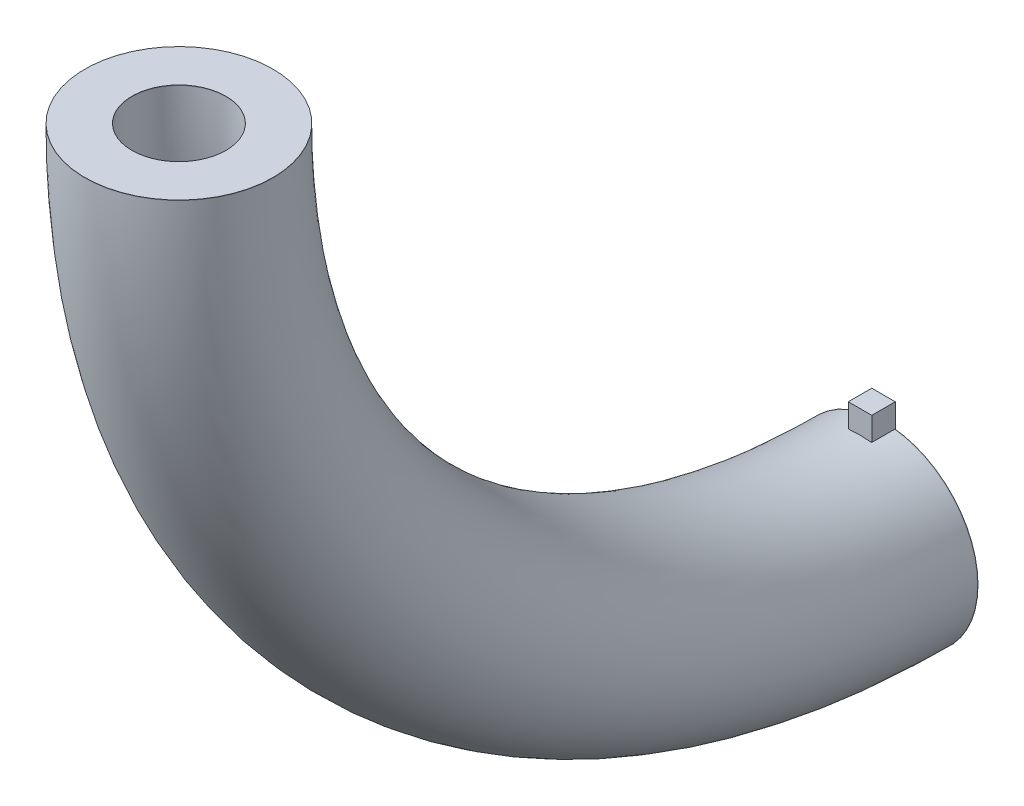
ISO-10303-21;
HEADER;
FILE_DESCRIPTION(('STEP AP214'),'2;1');
FILE_NAME('part.step','',(''),(''),'','','');
FILE_SCHEMA(('AUTOMOTIVE_DESIGN { 1 0 10303 214 1 1 1 1 }'));
ENDSEC;
DATA;
#1=APPLICATION_CONTEXT('core data for automotive mechanical design processes');
#2=APPLICATION_PROTOCOL_DEFINITION('international standard','automotive_design',2000,#1);
#3=PRODUCT_CONTEXT('',#1,'mechanical');
#4=PRODUCT('Part','Part','',(#3));
#5=PRODUCT_RELATED_PRODUCT_CATEGORY('part','',(#4));
#6=PRODUCT_DEFINITION_FORMATION('','',#4);
#7=PRODUCT_DEFINITION_CONTEXT('part definition',#1,'design');
#8=PRODUCT_DEFINITION('design','',#6,#7);
#9=PRODUCT_DEFINITION_SHAPE('','',#8);
#10=(LENGTH_UNIT() NAMED_UNIT(*) SI_UNIT(.MILLI.,.METRE.));
#11=(NAMED_UNIT(*) PLANE_ANGLE_UNIT() SI_UNIT($,.RADIAN.));
#12=(NAMED_UNIT(*) SI_UNIT($,.STERADIAN.) SOLID_ANGLE_UNIT());
#13=UNCERTAINTY_MEASURE_WITH_UNIT(LENGTH_MEASURE(1.E-05),#10,'distance_accuracy_value','');
#14=(GEOMETRIC_REPRESENTATION_CONTEXT(3) GLOBAL_UNCERTAINTY_ASSIGNED_CONTEXT((#13)) GLOBAL_UNIT_ASSIGNED_CONTEXT((#10,
#11,#12)) REPRESENTATION_CONTEXT('',''));
#15=CARTESIAN_POINT('',(0.,0.,0.));
#16=DIRECTION('',(0.,0.,1.));
#17=DIRECTION('',(1.,0.,0.));
#18=AXIS2_PLACEMENT_3D('',#15,#16,#17);
#19=CARTESIAN_POINT('',(0.,14.99,0.00999999999999959));
#20=DIRECTION('',(-1.,0.,0.));
#21=DIRECTION('',(0.,0.,1.));
#22=AXIS2_PLACEMENT_3D('',#19,#20,#21);
#23=TOROIDAL_SURFACE('',#22,14.99,2.);
#24=CARTESIAN_POINT('',(0.,14.99,15.));
#25=DIRECTION('',(0.,1.,0.));
#26=DIRECTION('',(1.,0.,0.));
#27=AXIS2_PLACEMENT_3D('',#24,#25,#26);
#28=CIRCLE('',#27,2.);
#29=CARTESIAN_POINT('',(2.,14.99,15.));
#30=VERTEX_POINT('',#29);
#31=EDGE_CURVE('E122',#30,#30,#28,.T.);
#32=ORIENTED_EDGE('',*,*,#31,.F.);
#33=EDGE_LOOP('',(#32));
#34=FACE_BOUND('',#33,.T.);
#35=CARTESIAN_POINT('',(0.,2.,0.00999999999999959));
#36=CARTESIAN_POINT('',(0.00277541085037885,2.,0.0170732180786881));
#37=CARTESIAN_POINT('',(0.00555082313203522,2.,0.0241464366166013));
#38=CARTESIAN_POINT('',(0.0935618743159835,2.,0.248446740129247));
#39=CARTESIAN_POINT('',(0.178781724111193,2.,0.465680885401677));
#40=CARTESIAN_POINT('',(0.348136764687458,2.,0.90057263324786));
#41=CARTESIAN_POINT('',(0.432271946457802,2.,1.11823023932218));
#42=CARTESIAN_POINT('',(0.515337549956219,2.,1.33630243825391));
#43=B_SPLINE_CURVE_WITH_KNOTS('',3,(#35,#36,#37,#38,#39,#40,#41,#42),.UNSPECIFIED.,.F.,.F.,(4,2,
2,4),(0.,0.0227947362344989,0.722847853738164,1.42290678308241),.UNSPECIFIED.);
#44=CARTESIAN_POINT('',(0.,2.,0.00999999999999776));
#45=VERTEX_POINT('',#44);
#46=CARTESIAN_POINT('',(0.195919297869507,2.,0.509999999999997));
#47=VERTEX_POINT('',#46);
#48=EDGE_CURVE('E44',#45,#47,#43,.T.);
#49=ORIENTED_EDGE('',*,*,#48,.T.);
#50=CARTESIAN_POINT('',(-0.181908763773715,2.00133032957437,0.509999999999997));
#51=CARTESIAN_POINT('',(-0.293737185188782,1.99110412585077,0.509999999999997));
#52=CARTESIAN_POINT('',(-0.404783340480492,1.97142353201096,0.509999999999997));
#53=CARTESIAN_POINT('',(-0.622085918102416,1.91367641319412,0.509999999999997));
#54=CARTESIAN_POINT('',(-0.728336400376222,1.87558773568901,0.509999999999997));
#55=CARTESIAN_POINT('',(-0.932889963828244,1.78212673631901,0.509999999999997));
#56=CARTESIAN_POINT('',(-1.03119698647625,1.72676305327726,0.509999999999997));
#57=CARTESIAN_POINT('',(-1.21709840250675,1.60033823965166,0.509999999999997));
#58=CARTESIAN_POINT('',(-1.30469543440206,1.52928098748995,0.509999999999997));
#59=CARTESIAN_POINT('',(-1.46677329653677,1.37343930998043,0.509999999999997));
#60=CARTESIAN_POINT('',(-1.54124719831917,1.28864767852902,0.509999999999997));
#61=CARTESIAN_POINT('',(-1.67491676848593,1.10776856215384,0.509999999999997));
#62=CARTESIAN_POINT('',(-1.73411178444127,1.01168059511624,0.509999999999997));
#63=CARTESIAN_POINT('',(-1.83557898771618,0.810872418535294,0.509999999999997));
#64=CARTESIAN_POINT('',(-1.87784025926893,0.706146693225231,0.509999999999997));
#65=CARTESIAN_POINT('',(-1.94418919795878,0.491088562453816,0.509999999999997));
#66=CARTESIAN_POINT('',(-1.96827685240917,0.380756153078587,0.509999999999997));
#67=CARTESIAN_POINT('',(-1.99760243723497,0.157567498462781,0.509999999999997));
#68=CARTESIAN_POINT('',(-2.00283257704932,0.044710229501782,0.509999999999997));
#69=CARTESIAN_POINT('',(-1.99427197211424,-0.18028049976667,0.509999999999997));
#70=CARTESIAN_POINT('',(-1.9804812507033,-0.292413960962063,0.509999999999997));
#71=CARTESIAN_POINT('',(-1.93426753546742,-0.512775516595181,0.509999999999997));
#72=CARTESIAN_POINT('',(-1.9018442255002,-0.621003544735648,0.509999999999997));
#73=CARTESIAN_POINT('',(-1.81928224382609,-0.830477540567552,0.509999999999997));
#74=CARTESIAN_POINT('',(-1.76914357619364,-0.931723509864819,0.509999999999997));
#75=CARTESIAN_POINT('',(-1.65258970085773,-1.12432472061953,0.509999999999997));
#76=CARTESIAN_POINT('',(-1.58617956881751,-1.21568303360986,0.509999999999997));
#77=CARTESIAN_POINT('',(-1.43895760115924,-1.38594701504637,0.509999999999997));
#78=CARTESIAN_POINT('',(-1.35814580515257,-1.46485271774199,0.509999999999997));
#79=CARTESIAN_POINT('',(-1.18445452352319,-1.60793267988628,0.509999999999997));
#80=CARTESIAN_POINT('',(-1.09158064066691,-1.6721137407877,0.509999999999997));
#81=CARTESIAN_POINT('',(-0.896372274670506,-1.78396482283071,0.509999999999997));
#82=CARTESIAN_POINT('',(-0.794037813283999,-1.83163488193645,0.509999999999997));
#83=CARTESIAN_POINT('',(-0.582860746030592,-1.90908997549074,0.509999999999997));
#84=CARTESIAN_POINT('',(-0.474020961984441,-1.93888270358035,0.509999999999997));
#85=CARTESIAN_POINT('',(-0.252883952877032,-1.9797673089549,0.509999999999997));
#86=CARTESIAN_POINT('',(-0.140586733960204,-1.99085921947231,0.509999999999997));
#87=CARTESIAN_POINT('',(0.0842460461658021,-1.99402607956957,0.509999999999997));
#88=CARTESIAN_POINT('',(0.196781537412421,-1.98610599856873,0.509999999999997));
#89=CARTESIAN_POINT('',(0.418925365307101,-1.9514846519213,0.509999999999997));
#90=CARTESIAN_POINT('',(0.528533703442322,-1.92478339581679,0.509999999999997));
#91=CARTESIAN_POINT('',(0.741710094081767,-1.85336005994715,0.509999999999997));
#92=CARTESIAN_POINT('',(0.845278267805384,-1.80863834197524,0.509999999999997));
#93=CARTESIAN_POINT('',(1.04343877634926,-1.70244583710679,0.509999999999997));
#94=CARTESIAN_POINT('',(1.13803110528832,-1.64097503923593,0.509999999999997));
#95=CARTESIAN_POINT('',(1.31557858025636,-1.50301566692949,0.509999999999997));
#96=CARTESIAN_POINT('',(1.39853108949959,-1.42652369911216,0.509999999999997));
#97=CARTESIAN_POINT('',(1.55042326927643,-1.26070398627142,0.509999999999997));
#98=CARTESIAN_POINT('',(1.61936290667366,-1.17137621089588,0.509999999999997));
#99=CARTESIAN_POINT('',(1.74130315006862,-0.982381692476545,0.509999999999997));
#100=CARTESIAN_POINT('',(1.79429718306945,-0.882710708525839,0.509999999999997));
#101=CARTESIAN_POINT('',(1.88280866139776,-0.675889623704342,0.509999999999997));
#102=CARTESIAN_POINT('',(1.91832607967268,-0.56873951125668,0.509999999999997));
#103=CARTESIAN_POINT('',(1.9708932797675,-0.349947918290134,0.509999999999997));
#104=CARTESIAN_POINT('',(1.98793439205709,-0.238304354794399,0.509999999999997));
#105=CARTESIAN_POINT('',(2.00303858131396,-0.01374051096792,0.509999999999997));
#106=CARTESIAN_POINT('',(2.00110157912928,0.0991797746856847,0.509999999999997));
#107=CARTESIAN_POINT('',(1.97830159907182,0.323132924382653,0.509999999999997));
#108=CARTESIAN_POINT('',(1.95743205956446,0.434165120459765,0.509999999999997));
#109=CARTESIAN_POINT('',(1.89734942726489,0.651150630172771,0.509999999999997));
#110=CARTESIAN_POINT('',(1.85813628054502,0.757103928876399,0.509999999999997));
#111=CARTESIAN_POINT('',(1.76247413839039,0.960929238571439,0.509999999999997));
#112=CARTESIAN_POINT('',(1.70602405425175,1.05880073861138,0.509999999999997));
#113=CARTESIAN_POINT('',(1.5774904627854,1.24366930275359,0.509999999999997));
#114=CARTESIAN_POINT('',(1.50540758993904,1.33066680796824,0.509999999999997));
#115=CARTESIAN_POINT('',(1.34768800136598,1.4912793088558,0.509999999999997));
#116=CARTESIAN_POINT('',(1.26205749430629,1.56490040168407,0.509999999999997));
#117=CARTESIAN_POINT('',(1.07962054742005,1.69672889638276,0.509999999999997));
#118=CARTESIAN_POINT('',(0.982811370711335,1.75493251204221,0.509999999999997));
#119=CARTESIAN_POINT('',(0.780815654962982,1.85423266985262,0.509999999999997));
#120=CARTESIAN_POINT('',(0.675630495344405,1.89533202195186,0.509999999999997));
#121=CARTESIAN_POINT('',(0.459934919586089,1.9592252273307,0.509999999999997));
#122=CARTESIAN_POINT('',(0.349431093352757,1.98204114511064,0.509999999999997));
#123=CARTESIAN_POINT('',(0.168255291797739,2.00376834979751,0.509999999999997));
#124=CARTESIAN_POINT('',(0.0982237600629602,2.00844131679795,0.509999999999997));
#125=CARTESIAN_POINT('',(-0.041943111363335,2.01041513824669,0.509999999999997));
#126=CARTESIAN_POINT('',(-0.112078451007244,2.00771599607485,0.509999999999997));
#127=CARTESIAN_POINT('',(-0.181908763773715,2.00133032957437,0.509999999999997));
#128=B_SPLINE_CURVE_WITH_KNOTS('',3,(#50,#51,#52,#53,#54,#55,#56,#57,#58,#59,#60,#61,#62,#63,
#64,#65,#66,#67,#68,#69,#70,#71,#72,#73,#74,#75,#76,#77,#78,#79,#80,#81,#82,#83,#84,#85,#86,#87,
#88,#89,#90,#91,#92,#93,#94,#95,#96,#97,#98,#99,#100,#101,#102,#103,#104,#105,#106,#107,#108,
#109,#110,#111,#112,#113,#114,#115,#116,#117,#118,#119,#120,#121,#122,#123,#124,#125,#126,#127),
.UNSPECIFIED.,.T.,.F.,(4,2,2,2,2,2,2,2,2,2,2,2,2,2,2,2,2,2,2,2,2,2,2,2,2,2,2,2,2,2,2,2,2,2,2,2,
2,2,4),(0.,0.336628962243205,0.673664040713694,1.01053084527509,1.34731449140332,
1.68427541574069,2.02125072638393,2.35844290867712,2.69563532635847,3.03296703160591,
3.37029832294934,3.7076353380189,4.04497227550275,4.38220411896179,4.71943503488822,
5.05650986559675,5.39358392125573,5.73051281038022,6.06744110076134,6.40428133326448,
6.74112139463062,7.077954693663,7.41478821339548,7.75169791376836,8.08860841082614,
8.42565759735152,8.76270730560367,9.09991509739013,9.43712429556885,9.77445040830402,
10.1117775127376,10.44912592753,10.7864606530674,11.1236412288616,11.4609045325678,
11.7981124075853,12.1349127237402,12.3451179309616,12.5553230418113),.UNSPECIFIED.);
#129=CARTESIAN_POINT('',(-0.195919297877991,2.,0.509999999999997));
#130=VERTEX_POINT('',#129);
#131=EDGE_CURVE('E11',#47,#130,#128,.T.);
#132=ORIENTED_EDGE('',*,*,#131,.T.);
#133=CARTESIAN_POINT('',(0.,2.,0.00999999999999959));
#134=CARTESIAN_POINT('',(-0.00277541085037885,2.,0.0170732180786881));
#135=CARTESIAN_POINT('',(-0.00555082313203522,2.,0.0241464366166013));
#136=CARTESIAN_POINT('',(-0.0935618743159835,2.,0.248446740129247));
#137=CARTESIAN_POINT('',(-0.178781724111193,2.,0.465680885401677));
#138=CARTESIAN_POINT('',(-0.348136764687458,2.,0.90057263324786));
#139=CARTESIAN_POINT('',(-0.432271946457802,2.,1.11823023932218));
#140=CARTESIAN_POINT('',(-0.515337549956219,2.,1.33630243825391));
#141=B_SPLINE_CURVE_WITH_KNOTS('',3,(#133,#134,#135,#136,#137,#138,#139,#140),.UNSPECIFIED.,.F.,
.F.,(4,2,2,4),(0.,0.0227947362344989,0.722847853738164,1.42290678308241),.UNSPECIFIED.);
#142=EDGE_CURVE('E140',#130,#45,#141,.F.);
#143=ORIENTED_EDGE('',*,*,#142,.T.);
#144=CARTESIAN_POINT('',(0.,0.,0.00999999999999776));
#145=DIRECTION('',(0.,0.,1.));
#146=DIRECTION('',(1.,0.,0.));
#147=AXIS2_PLACEMENT_3D('',#144,#145,#146);
#148=CIRCLE('',#147,2.);
#149=EDGE_CURVE('E119',#45,#45,#148,.T.);
#150=ORIENTED_EDGE('',*,*,#149,.T.);
#151=EDGE_LOOP('',(#49,#132,#143,#150));
#152=FACE_BOUND('',#151,.T.);
#153=ADVANCED_FACE('F33',(#34,#152),#23,.T.);
#154=CARTESIAN_POINT('',(0.,0.,0.));
#155=DIRECTION('',(0.,0.,1.));
#156=DIRECTION('',(0.,-1.,0.));
#157=AXIS2_PLACEMENT_3D('',#154,#155,#156);
#158=CYLINDRICAL_SURFACE('',#157,2.);
#159=ORIENTED_EDGE('',*,*,#149,.F.);
#160=EDGE_LOOP('',(#159));
#161=FACE_BOUND('',#160,.T.);
#162=CARTESIAN_POINT('',(0.,0.,0.));
#163=DIRECTION('',(0.,0.,1.));
#164=DIRECTION('',(1.,0.,0.));
#165=AXIS2_PLACEMENT_3D('',#162,#163,#164);
#166=CIRCLE('',#165,2.);
#167=CARTESIAN_POINT('',(2.,0.,0.));
#168=VERTEX_POINT('',#167);
#169=EDGE_CURVE('E57',#168,#168,#166,.T.);
#170=ORIENTED_EDGE('',*,*,#169,.T.);
#171=EDGE_LOOP('',(#170));
#172=FACE_BOUND('',#171,.T.);
#173=ADVANCED_FACE('F160',(#161,#172),#158,.T.);
#174=CARTESIAN_POINT('',(0.,14.99,15.));
#175=DIRECTION('',(0.,1.,0.));
#176=DIRECTION('',(0.,0.,1.));
#177=AXIS2_PLACEMENT_3D('',#174,#175,#176);
#178=CYLINDRICAL_SURFACE('',#177,2.);
#179=CARTESIAN_POINT('',(0.,15.,15.));
#180=DIRECTION('',(0.,1.,0.));
#181=DIRECTION('',(1.,0.,0.));
#182=AXIS2_PLACEMENT_3D('',#179,#180,#181);
#183=CIRCLE('',#182,2.);
#184=CARTESIAN_POINT('',(2.,15.,15.));
#185=VERTEX_POINT('',#184);
#186=EDGE_CURVE('E132',#185,#185,#183,.T.);
#187=ORIENTED_EDGE('',*,*,#186,.F.);
#188=EDGE_LOOP('',(#187));
#189=FACE_BOUND('',#188,.T.);
#190=ORIENTED_EDGE('',*,*,#31,.T.);
#191=EDGE_LOOP('',(#190));
#192=FACE_BOUND('',#191,.T.);
#193=ADVANCED_FACE('F35',(#189,#192),#178,.T.);
#194=CARTESIAN_POINT('',(0.,0.,0.));
#195=DIRECTION('',(0.,0.,1.));
#196=DIRECTION('',(1.,0.,0.));
#197=AXIS2_PLACEMENT_3D('',#194,#195,#196);
#198=PLANE('',#197);
#199=CARTESIAN_POINT('',(0.,0.,0.));
#200=DIRECTION('',(0.,0.,1.));
#201=DIRECTION('',(1.,0.,0.));
#202=AXIS2_PLACEMENT_3D('',#199,#200,#201);
#203=CIRCLE('',#202,1.);
#204=CARTESIAN_POINT('',(1.,0.,0.));
#205=VERTEX_POINT('',#204);
#206=EDGE_CURVE('E128',#205,#205,#203,.F.);
#207=ORIENTED_EDGE('',*,*,#206,.F.);
#208=EDGE_LOOP('',(#207));
#209=FACE_BOUND('',#208,.T.);
#210=ORIENTED_EDGE('',*,*,#169,.F.);
#211=EDGE_LOOP('',(#210));
#212=FACE_BOUND('',#211,.T.);
#213=ADVANCED_FACE('F169',(#209,#212),#198,.F.);
#214=CARTESIAN_POINT('',(0.,15.,15.));
#215=DIRECTION('',(0.,1.,0.));
#216=DIRECTION('',(1.,0.,0.));
#217=AXIS2_PLACEMENT_3D('',#214,#215,#216);
#218=PLANE('',#217);
#219=CARTESIAN_POINT('',(0.,15.,15.));
#220=DIRECTION('',(0.,1.,0.));
#221=DIRECTION('',(1.,0.,0.));
#222=AXIS2_PLACEMENT_3D('',#219,#220,#221);
#223=CIRCLE('',#222,1.);
#224=CARTESIAN_POINT('',(1.,15.,15.));
#225=VERTEX_POINT('',#224);
#226=EDGE_CURVE('E138',#225,#225,#223,.F.);
#227=ORIENTED_EDGE('',*,*,#226,.T.);
#228=EDGE_LOOP('',(#227));
#229=FACE_BOUND('',#228,.T.);
#230=ORIENTED_EDGE('',*,*,#186,.T.);
#231=EDGE_LOOP('',(#230));
#232=FACE_BOUND('',#231,.T.);
#233=ADVANCED_FACE('F172',(#229,#232),#218,.T.);
#234=CARTESIAN_POINT('',(0.,0.,0.));
#235=DIRECTION('',(0.,0.,1.));
#236=DIRECTION('',(0.,-1.,0.));
#237=AXIS2_PLACEMENT_3D('',#234,#235,#236);
#238=CYLINDRICAL_SURFACE('',#237,1.);
#239=CARTESIAN_POINT('',(0.,0.,0.00999999999999776));
#240=DIRECTION('',(0.,0.,1.));
#241=DIRECTION('',(1.,0.,0.));
#242=AXIS2_PLACEMENT_3D('',#239,#240,#241);
#243=CIRCLE('',#242,1.);
#244=CARTESIAN_POINT('',(0.,-1.,0.00999999999999764));
#245=VERTEX_POINT('',#244);
#246=EDGE_CURVE('E131',#245,#245,#243,.F.);
#247=ORIENTED_EDGE('',*,*,#246,.F.);
#248=EDGE_LOOP('',(#247));
#249=FACE_BOUND('',#248,.T.);
#250=ORIENTED_EDGE('',*,*,#206,.T.);
#251=EDGE_LOOP('',(#250));
#252=FACE_BOUND('',#251,.T.);
#253=ADVANCED_FACE('F176',(#249,#252),#238,.F.);
#254=CARTESIAN_POINT('',(0.,14.99,0.00999999999999959));
#255=DIRECTION('',(-1.,0.,0.));
#256=DIRECTION('',(0.,0.,1.));
#257=AXIS2_PLACEMENT_3D('',#254,#255,#256);
#258=TOROIDAL_SURFACE('',#257,14.99,1.);
#259=CARTESIAN_POINT('',(0.,14.99,15.));
#260=DIRECTION('',(0.,1.,0.));
#261=DIRECTION('',(1.,0.,0.));
#262=AXIS2_PLACEMENT_3D('',#259,#260,#261);
#263=CIRCLE('',#262,1.);
#264=CARTESIAN_POINT('',(0.,14.99,16.));
#265=VERTEX_POINT('',#264);
#266=EDGE_CURVE('E135',#265,#265,#263,.F.);
#267=CARTESIAN_POINT('',(0.,14.99,0.00999999999999959));
#268=DIRECTION('',(-1.,0.,0.));
#269=DIRECTION('',(0.,0.,1.));
#270=AXIS2_PLACEMENT_3D('',#267,#268,#269);
#271=CIRCLE('',#270,15.99);
#272=EDGE_CURVE('',#245,#265,#271,.T.);
#273=ORIENTED_EDGE('',*,*,#246,.T.);
#274=ORIENTED_EDGE('',*,*,#266,.F.);
#275=ORIENTED_EDGE('',*,*,#272,.T.);
#276=ORIENTED_EDGE('',*,*,#272,.F.);
#277=EDGE_LOOP('',(#273,#275,#274,#276));
#278=FACE_BOUND('',#277,.T.);
#279=ADVANCED_FACE('F180',(#278),#258,.F.);
#280=CARTESIAN_POINT('',(0.,14.99,15.));
#281=DIRECTION('',(0.,1.,0.));
#282=DIRECTION('',(0.,0.,1.));
#283=AXIS2_PLACEMENT_3D('',#280,#281,#282);
#284=CYLINDRICAL_SURFACE('',#283,1.);
#285=ORIENTED_EDGE('',*,*,#226,.F.);
#286=EDGE_LOOP('',(#285));
#287=FACE_BOUND('',#286,.T.);
#288=ORIENTED_EDGE('',*,*,#266,.T.);
#289=EDGE_LOOP('',(#288));
#290=FACE_BOUND('',#289,.T.);
#291=ADVANCED_FACE('F162',(#287,#290),#284,.F.);
#292=CARTESIAN_POINT('',(0.25,2.,0.00999999999999721));
#293=DIRECTION('',(0.,1.,0.));
#294=DIRECTION('',(0.,0.,1.));
#295=AXIS2_PLACEMENT_3D('',#292,#293,#294);
#296=PLANE('',#295);
#297=ORIENTED_EDGE('',*,*,#48,.F.);
#298=DIRECTION('',(-1.,0.,0.));
#299=VECTOR('',#298,1.);
#300=CARTESIAN_POINT('',(0.25,2.,0.00999999999999721));
#301=LINE('',#300,#299);
#302=CARTESIAN_POINT('',(0.25,2.,0.00999999999999721));
#303=VERTEX_POINT('',#302);
#304=EDGE_CURVE('E51',#303,#45,#301,.T.);
#305=ORIENTED_EDGE('',*,*,#304,.F.);
#306=DIRECTION('',(0.,0.,-1.));
#307=VECTOR('',#306,1.);
#308=CARTESIAN_POINT('',(0.25,2.,0.00999999999999721));
#309=LINE('',#308,#307);
#310=CARTESIAN_POINT('',(0.25,2.,0.509999999999997));
#311=VERTEX_POINT('',#310);
#312=EDGE_CURVE('E113',#311,#303,#309,.T.);
#313=ORIENTED_EDGE('',*,*,#312,.F.);
#314=DIRECTION('',(-1.,0.,0.));
#315=VECTOR('',#314,1.);
#316=CARTESIAN_POINT('',(0.25,2.,0.509999999999997));
#317=LINE('',#316,#315);
#318=EDGE_CURVE('E124',#311,#47,#317,.T.);
#319=ORIENTED_EDGE('',*,*,#318,.T.);
#320=EDGE_LOOP('',(#297,#305,#313,#319));
#321=FACE_BOUND('',#320,.T.);
#322=ADVANCED_FACE('F168',(#321),#296,.F.);
#323=CARTESIAN_POINT('',(0.25,2.,0.00999999999999721));
#324=DIRECTION('',(0.,0.,1.));
#325=DIRECTION('',(1.,0.,0.));
#326=AXIS2_PLACEMENT_3D('',#323,#324,#325);
#327=PLANE('',#326);
#328=DIRECTION('',(0.,1.,0.));
#329=VECTOR('',#328,1.);
#330=CARTESIAN_POINT('',(-0.25,2.,0.00999999999999721));
#331=LINE('',#330,#329);
#332=CARTESIAN_POINT('',(-0.25,2.,0.00999999999999721));
#333=VERTEX_POINT('',#332);
#334=CARTESIAN_POINT('',(-0.25,2.5,0.00999999999999721));
#335=VERTEX_POINT('',#334);
#336=EDGE_CURVE('E118',#333,#335,#331,.T.);
#337=ORIENTED_EDGE('',*,*,#336,.T.);
#338=DIRECTION('',(-1.,0.,0.));
#339=VECTOR('',#338,1.);
#340=CARTESIAN_POINT('',(0.25,2.5,0.00999999999999721));
#341=LINE('',#340,#339);
#342=CARTESIAN_POINT('',(0.25,2.5,0.00999999999999721));
#343=VERTEX_POINT('',#342);
#344=EDGE_CURVE('E102',#343,#335,#341,.T.);
#345=ORIENTED_EDGE('',*,*,#344,.F.);
#346=DIRECTION('',(0.,1.,0.));
#347=VECTOR('',#346,1.);
#348=CARTESIAN_POINT('',(0.25,2.,0.00999999999999721));
#349=LINE('',#348,#347);
#350=EDGE_CURVE('E109',#303,#343,#349,.T.);
#351=ORIENTED_EDGE('',*,*,#350,.F.);
#352=ORIENTED_EDGE('',*,*,#304,.T.);
#353=EDGE_CURVE('E210',#45,#333,#301,.T.);
#354=ORIENTED_EDGE('',*,*,#353,.T.);
#355=EDGE_LOOP('',(#337,#345,#351,#352,#354));
#356=FACE_BOUND('',#355,.T.);
#357=ADVANCED_FACE('F116',(#356),#327,.F.);
#358=CARTESIAN_POINT('',(0.25,2.5,0.00999999999999721));
#359=DIRECTION('',(0.,-1.,0.));
#360=DIRECTION('',(0.,0.,-1.));
#361=AXIS2_PLACEMENT_3D('',#358,#359,#360);
#362=PLANE('',#361);
#363=DIRECTION('',(0.,0.,1.));
#364=VECTOR('',#363,1.);
#365=CARTESIAN_POINT('',(-0.25,2.5,0.00999999999999721));
#366=LINE('',#365,#364);
#367=CARTESIAN_POINT('',(-0.25,2.5,0.509999999999997));
#368=VERTEX_POINT('',#367);
#369=EDGE_CURVE('E218',#335,#368,#366,.T.);
#370=ORIENTED_EDGE('',*,*,#369,.T.);
#371=DIRECTION('',(-1.,0.,0.));
#372=VECTOR('',#371,1.);
#373=CARTESIAN_POINT('',(0.25,2.5,0.509999999999997));
#374=LINE('',#373,#372);
#375=CARTESIAN_POINT('',(0.25,2.5,0.509999999999997));
#376=VERTEX_POINT('',#375);
#377=EDGE_CURVE('E105',#376,#368,#374,.T.);
#378=ORIENTED_EDGE('',*,*,#377,.F.);
#379=DIRECTION('',(0.,0.,1.));
#380=VECTOR('',#379,1.);
#381=CARTESIAN_POINT('',(0.25,2.5,0.00999999999999721));
#382=LINE('',#381,#380);
#383=EDGE_CURVE('E98',#343,#376,#382,.T.);
#384=ORIENTED_EDGE('',*,*,#383,.F.);
#385=ORIENTED_EDGE('',*,*,#344,.T.);
#386=EDGE_LOOP('',(#370,#378,#384,#385));
#387=FACE_BOUND('',#386,.T.);
#388=ADVANCED_FACE('F100',(#387),#362,.F.);
#389=CARTESIAN_POINT('',(0.25,2.,0.509999999999997));
#390=DIRECTION('',(0.,0.,-1.));
#391=DIRECTION('',(-1.,0.,0.));
#392=AXIS2_PLACEMENT_3D('',#389,#390,#391);
#393=PLANE('',#392);
#394=ORIENTED_EDGE('',*,*,#131,.F.);
#395=ORIENTED_EDGE('',*,*,#318,.F.);
#396=DIRECTION('',(0.,-1.,0.));
#397=VECTOR('',#396,1.);
#398=CARTESIAN_POINT('',(0.25,2.,0.509999999999997));
#399=LINE('',#398,#397);
#400=EDGE_CURVE('E108',#376,#311,#399,.T.);
#401=ORIENTED_EDGE('',*,*,#400,.F.);
#402=ORIENTED_EDGE('',*,*,#377,.T.);
#403=DIRECTION('',(0.,-1.,0.));
#404=VECTOR('',#403,1.);
#405=CARTESIAN_POINT('',(-0.25,2.,0.509999999999997));
#406=LINE('',#405,#404);
#407=CARTESIAN_POINT('',(-0.25,2.,0.509999999999997));
#408=VERTEX_POINT('',#407);
#409=EDGE_CURVE('E216',#368,#408,#406,.T.);
#410=ORIENTED_EDGE('',*,*,#409,.T.);
#411=EDGE_CURVE('E203',#130,#408,#317,.T.);
#412=ORIENTED_EDGE('',*,*,#411,.F.);
#413=EDGE_LOOP('',(#394,#395,#401,#402,#410,#412));
#414=FACE_BOUND('',#413,.T.);
#415=ADVANCED_FACE('F191',(#414),#393,.F.);
#416=ORIENTED_EDGE('',*,*,#142,.F.);
#417=ORIENTED_EDGE('',*,*,#411,.T.);
#418=DIRECTION('',(0.,0.,-1.));
#419=VECTOR('',#418,1.);
#420=CARTESIAN_POINT('',(-0.25,2.,0.00999999999999721));
#421=LINE('',#420,#419);
#422=EDGE_CURVE('E114',#408,#333,#421,.T.);
#423=ORIENTED_EDGE('',*,*,#422,.T.);
#424=ORIENTED_EDGE('',*,*,#353,.F.);
#425=EDGE_LOOP('',(#416,#417,#423,#424));
#426=FACE_BOUND('',#425,.T.);
#427=ADVANCED_FACE('F154',(#426),#296,.F.);
#428=CARTESIAN_POINT('',(0.25,0.,0.));
#429=DIRECTION('',(1.,0.,0.));
#430=DIRECTION('',(0.,0.,-1.));
#431=AXIS2_PLACEMENT_3D('',#428,#429,#430);
#432=PLANE('',#431);
#433=ORIENTED_EDGE('',*,*,#350,.T.);
#434=ORIENTED_EDGE('',*,*,#383,.T.);
#435=ORIENTED_EDGE('',*,*,#400,.T.);
#436=ORIENTED_EDGE('',*,*,#312,.T.);
#437=EDGE_LOOP('',(#433,#434,#435,#436));
#438=FACE_BOUND('',#437,.T.);
#439=ADVANCED_FACE('F111',(#438),#432,.T.);
#440=CARTESIAN_POINT('',(-0.25,0.,0.));
#441=DIRECTION('',(1.,0.,0.));
#442=DIRECTION('',(0.,0.,-1.));
#443=AXIS2_PLACEMENT_3D('',#440,#441,#442);
#444=PLANE('',#443);
#445=ORIENTED_EDGE('',*,*,#336,.F.);
#446=ORIENTED_EDGE('',*,*,#422,.F.);
#447=ORIENTED_EDGE('',*,*,#409,.F.);
#448=ORIENTED_EDGE('',*,*,#369,.F.);
#449=EDGE_LOOP('',(#445,#446,#447,#448));
#450=FACE_BOUND('',#449,.T.);
#451=ADVANCED_FACE('F223',(#450),#444,.F.);
#452=CLOSED_SHELL('',(#153,#173,#193,#213,#233,#253,#279,#291,#322,#357,#388,#415,#427,#439,#451));
#453=MANIFOLD_SOLID_BREP('B2',#452);
#454=ADVANCED_BREP_SHAPE_REPRESENTATION('',(#18,#453),#14);
#455=SHAPE_DEFINITION_REPRESENTATION(#9,#454);
ENDSEC;
END-ISO-10303-21;
